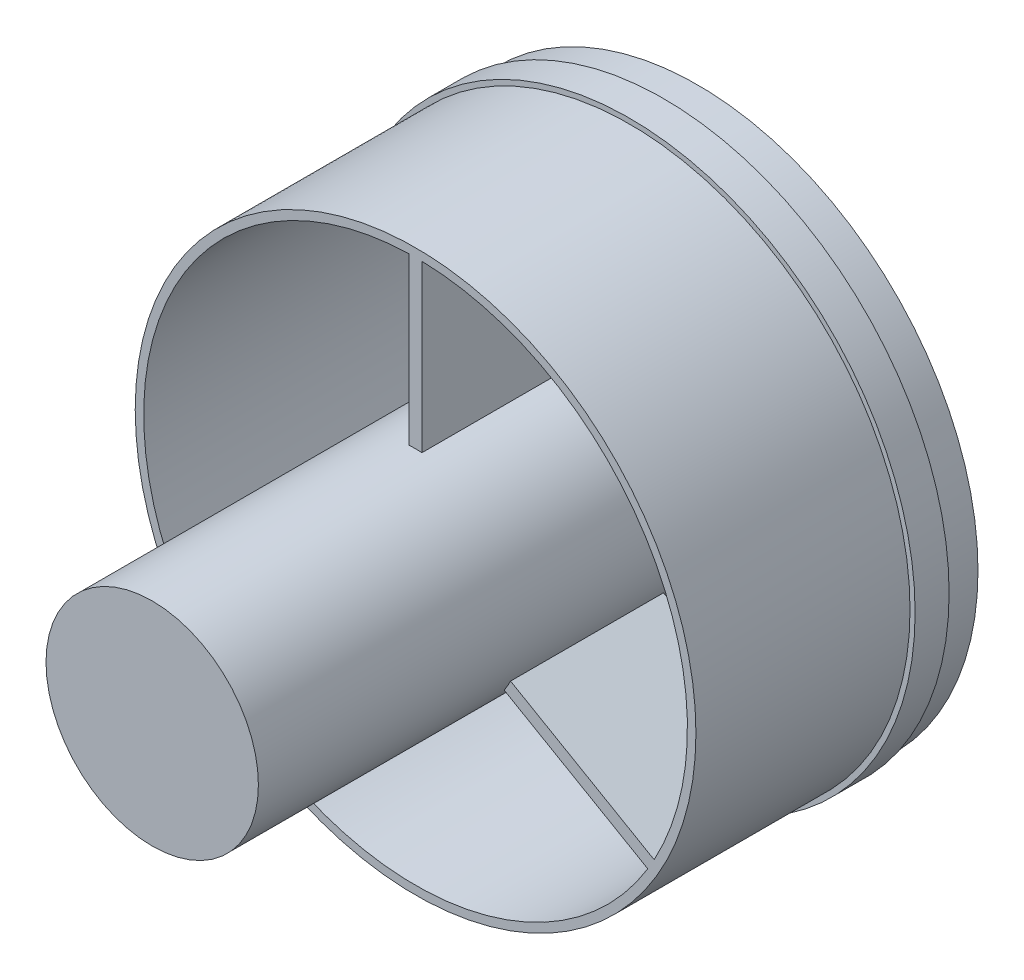
ISO-10303-21;
HEADER;
FILE_DESCRIPTION(('STEP AP214'),'2;1');
FILE_NAME('part.step','',(''),(''),'','','');
FILE_SCHEMA(('AUTOMOTIVE_DESIGN { 1 0 10303 214 1 1 1 1 }'));
ENDSEC;
DATA;
#1=APPLICATION_CONTEXT('core data for automotive mechanical design processes');
#2=APPLICATION_PROTOCOL_DEFINITION('international standard','automotive_design',2000,#1);
#3=PRODUCT_CONTEXT('',#1,'mechanical');
#4=PRODUCT('Part','Part','',(#3));
#5=PRODUCT_RELATED_PRODUCT_CATEGORY('part','',(#4));
#6=PRODUCT_DEFINITION_FORMATION('','',#4);
#7=PRODUCT_DEFINITION_CONTEXT('part definition',#1,'design');
#8=PRODUCT_DEFINITION('design','',#6,#7);
#9=PRODUCT_DEFINITION_SHAPE('','',#8);
#10=(LENGTH_UNIT() NAMED_UNIT(*) SI_UNIT(.MILLI.,.METRE.));
#11=(NAMED_UNIT(*) PLANE_ANGLE_UNIT() SI_UNIT($,.RADIAN.));
#12=(NAMED_UNIT(*) SI_UNIT($,.STERADIAN.) SOLID_ANGLE_UNIT());
#13=UNCERTAINTY_MEASURE_WITH_UNIT(LENGTH_MEASURE(1.E-05),#10,'distance_accuracy_value','');
#14=(GEOMETRIC_REPRESENTATION_CONTEXT(3) GLOBAL_UNCERTAINTY_ASSIGNED_CONTEXT((#13)) GLOBAL_UNIT_ASSIGNED_CONTEXT((#10,
#11,#12)) REPRESENTATION_CONTEXT('',''));
#15=CARTESIAN_POINT('',(0.,0.,0.));
#16=DIRECTION('',(0.,0.,1.));
#17=DIRECTION('',(1.,0.,0.));
#18=AXIS2_PLACEMENT_3D('',#15,#16,#17);
#19=CARTESIAN_POINT('',(0.,0.,0.));
#20=DIRECTION('',(0.,0.,1.));
#21=DIRECTION('',(1.,0.,0.));
#22=AXIS2_PLACEMENT_3D('',#19,#20,#21);
#23=PLANE('',#22);
#24=CARTESIAN_POINT('',(0.,0.,0.));
#25=DIRECTION('',(0.,0.,1.));
#26=DIRECTION('',(1.,0.,0.));
#27=AXIS2_PLACEMENT_3D('',#24,#25,#26);
#28=CIRCLE('',#27,33.);
#29=CARTESIAN_POINT('',(33.,0.,0.));
#30=VERTEX_POINT('',#29);
#31=EDGE_CURVE('E238',#30,#30,#28,.T.);
#32=ORIENTED_EDGE('',*,*,#31,.F.);
#33=EDGE_LOOP('',(#32));
#34=FACE_BOUND('',#33,.T.);
#35=CARTESIAN_POINT('',(0.,0.,0.));
#36=DIRECTION('',(0.,0.,1.));
#37=DIRECTION('',(1.,0.,0.));
#38=AXIS2_PLACEMENT_3D('',#35,#36,#37);
#39=CIRCLE('',#38,32.);
#40=CARTESIAN_POINT('',(32.,0.,0.));
#41=VERTEX_POINT('',#40);
#42=EDGE_CURVE('E233',#41,#41,#39,.T.);
#43=ORIENTED_EDGE('',*,*,#42,.T.);
#44=EDGE_LOOP('',(#43));
#45=FACE_BOUND('',#44,.T.);
#46=ADVANCED_FACE('F39',(#34,#45),#23,.F.);
#47=CARTESIAN_POINT('',(0.,0.,4.));
#48=DIRECTION('',(0.,0.,-1.));
#49=DIRECTION('',(-1.,0.,0.));
#50=AXIS2_PLACEMENT_3D('',#47,#48,#49);
#51=CYLINDRICAL_SURFACE('',#50,33.);
#52=CARTESIAN_POINT('',(0.,0.,4.));
#53=DIRECTION('',(0.,0.,1.));
#54=DIRECTION('',(1.,0.,0.));
#55=AXIS2_PLACEMENT_3D('',#52,#53,#54);
#56=CIRCLE('',#55,33.);
#57=CARTESIAN_POINT('',(33.,0.,4.));
#58=VERTEX_POINT('',#57);
#59=EDGE_CURVE('E229',#58,#58,#56,.T.);
#60=ORIENTED_EDGE('',*,*,#59,.F.);
#61=EDGE_LOOP('',(#60));
#62=FACE_BOUND('',#61,.T.);
#63=ORIENTED_EDGE('',*,*,#31,.T.);
#64=EDGE_LOOP('',(#63));
#65=FACE_BOUND('',#64,.T.);
#66=ADVANCED_FACE('F41',(#62,#65),#51,.T.);
#67=CARTESIAN_POINT('',(0.,0.,4.));
#68=DIRECTION('',(0.,0.,-1.));
#69=DIRECTION('',(-1.,0.,0.));
#70=AXIS2_PLACEMENT_3D('',#67,#68,#69);
#71=CYLINDRICAL_SURFACE('',#70,32.);
#72=DIRECTION('',(0.,0.,-1.));
#73=VECTOR('',#72,1.);
#74=CARTESIAN_POINT('',(-28.0802003241269,-15.3460858122488,4.));
#75=LINE('',#74,#73);
#76=CARTESIAN_POINT('',(-28.0802003241269,-15.3460858122488,15.2));
#77=VERTEX_POINT('',#76);
#78=CARTESIAN_POINT('',(-28.0802003241269,-15.3460858122488,33.2));
#79=VERTEX_POINT('',#78);
#80=EDGE_CURVE('E54',#77,#79,#75,.F.);
#81=ORIENTED_EDGE('',*,*,#80,.F.);
#82=CARTESIAN_POINT('',(0.,0.,15.2));
#83=DIRECTION('',(0.,0.,-1.));
#84=DIRECTION('',(-1.,0.,0.));
#85=AXIS2_PLACEMENT_3D('',#82,#83,#84);
#86=CIRCLE('',#85,32.);
#87=CARTESIAN_POINT('',(-27.3302003241269,-16.6451239179255,15.2));
#88=VERTEX_POINT('',#87);
#89=EDGE_CURVE('E58',#88,#77,#86,.T.);
#90=ORIENTED_EDGE('',*,*,#89,.F.);
#91=DIRECTION('',(0.,0.,-1.));
#92=VECTOR('',#91,1.);
#93=CARTESIAN_POINT('',(-27.3302003241269,-16.6451239179255,4.));
#94=LINE('',#93,#92);
#95=CARTESIAN_POINT('',(-27.3302003241269,-16.6451239179255,33.2));
#96=VERTEX_POINT('',#95);
#97=EDGE_CURVE('E140',#96,#88,#94,.T.);
#98=ORIENTED_EDGE('',*,*,#97,.F.);
#99=CARTESIAN_POINT('',(0.,0.,33.2));
#100=DIRECTION('',(0.,0.,1.));
#101=DIRECTION('',(1.,0.,0.));
#102=AXIS2_PLACEMENT_3D('',#99,#100,#101);
#103=CIRCLE('',#102,32.);
#104=CARTESIAN_POINT('',(27.3302003241269,-16.6451239179255,33.2));
#105=VERTEX_POINT('',#104);
#106=EDGE_CURVE('E221',#96,#105,#103,.T.);
#107=ORIENTED_EDGE('',*,*,#106,.T.);
#108=DIRECTION('',(0.,0.,-1.));
#109=VECTOR('',#108,1.);
#110=CARTESIAN_POINT('',(27.3302003241269,-16.6451239179255,4.));
#111=LINE('',#110,#109);
#112=CARTESIAN_POINT('',(27.3302003241269,-16.6451239179255,15.2));
#113=VERTEX_POINT('',#112);
#114=EDGE_CURVE('E178',#113,#105,#111,.F.);
#115=ORIENTED_EDGE('',*,*,#114,.F.);
#116=CARTESIAN_POINT('',(0.,0.,15.2));
#117=DIRECTION('',(0.,0.,-1.));
#118=DIRECTION('',(-1.,0.,0.));
#119=AXIS2_PLACEMENT_3D('',#116,#117,#118);
#120=CIRCLE('',#119,32.);
#121=CARTESIAN_POINT('',(28.0802003241269,-15.3460858122488,15.2));
#122=VERTEX_POINT('',#121);
#123=EDGE_CURVE('E171',#122,#113,#120,.T.);
#124=ORIENTED_EDGE('',*,*,#123,.F.);
#125=DIRECTION('',(0.,0.,-1.));
#126=VECTOR('',#125,1.);
#127=CARTESIAN_POINT('',(28.0802003241269,-15.3460858122488,4.));
#128=LINE('',#127,#126);
#129=CARTESIAN_POINT('',(28.0802003241269,-15.3460858122488,33.2));
#130=VERTEX_POINT('',#129);
#131=EDGE_CURVE('E175',#130,#122,#128,.T.);
#132=ORIENTED_EDGE('',*,*,#131,.F.);
#133=CARTESIAN_POINT('',(0.75,31.9912097301743,33.2));
#134=VERTEX_POINT('',#133);
#135=EDGE_CURVE('E217',#130,#134,#103,.T.);
#136=ORIENTED_EDGE('',*,*,#135,.T.);
#137=DIRECTION('',(0.,0.,-1.));
#138=VECTOR('',#137,1.);
#139=CARTESIAN_POINT('',(0.75,31.9912097301743,4.));
#140=LINE('',#139,#138);
#141=CARTESIAN_POINT('',(0.75,31.9912097301743,15.2));
#142=VERTEX_POINT('',#141);
#143=EDGE_CURVE('E214',#142,#134,#140,.F.);
#144=ORIENTED_EDGE('',*,*,#143,.F.);
#145=CARTESIAN_POINT('',(0.,0.,15.2));
#146=DIRECTION('',(0.,0.,-1.));
#147=DIRECTION('',(-1.,0.,0.));
#148=AXIS2_PLACEMENT_3D('',#145,#146,#147);
#149=CIRCLE('',#148,32.);
#150=CARTESIAN_POINT('',(-0.75,31.9912097301743,15.2));
#151=VERTEX_POINT('',#150);
#152=EDGE_CURVE('E206',#151,#142,#149,.T.);
#153=ORIENTED_EDGE('',*,*,#152,.F.);
#154=DIRECTION('',(0.,0.,-1.));
#155=VECTOR('',#154,1.);
#156=CARTESIAN_POINT('',(-0.75,31.9912097301743,4.));
#157=LINE('',#156,#155);
#158=CARTESIAN_POINT('',(-0.75,31.9912097301743,33.2));
#159=VERTEX_POINT('',#158);
#160=EDGE_CURVE('E211',#159,#151,#157,.T.);
#161=ORIENTED_EDGE('',*,*,#160,.F.);
#162=EDGE_CURVE('E218',#159,#79,#103,.T.);
#163=ORIENTED_EDGE('',*,*,#162,.T.);
#164=EDGE_LOOP('',(#81,#90,#98,#107,#115,#124,#132,#136,#144,#153,#161,#163));
#165=FACE_BOUND('',#164,.T.);
#166=ORIENTED_EDGE('',*,*,#42,.F.);
#167=EDGE_LOOP('',(#166));
#168=FACE_BOUND('',#167,.T.);
#169=ADVANCED_FACE('F262',(#165,#168),#71,.F.);
#170=CARTESIAN_POINT('',(0.,0.,8.));
#171=DIRECTION('',(0.,0.,1.));
#172=DIRECTION('',(1.,0.,0.));
#173=AXIS2_PLACEMENT_3D('',#170,#171,#172);
#174=PLANE('',#173);
#175=CARTESIAN_POINT('',(0.,0.,8.));
#176=DIRECTION('',(0.,0.,1.));
#177=DIRECTION('',(1.,0.,0.));
#178=AXIS2_PLACEMENT_3D('',#175,#176,#177);
#179=CIRCLE('',#178,33.);
#180=CARTESIAN_POINT('',(33.,0.,8.));
#181=VERTEX_POINT('',#180);
#182=EDGE_CURVE('E225',#181,#181,#179,.T.);
#183=ORIENTED_EDGE('',*,*,#182,.F.);
#184=EDGE_LOOP('',(#183));
#185=FACE_BOUND('',#184,.T.);
#186=CARTESIAN_POINT('',(0.,0.,8.));
#187=DIRECTION('',(0.,0.,1.));
#188=DIRECTION('',(1.,0.,0.));
#189=AXIS2_PLACEMENT_3D('',#186,#187,#188);
#190=CIRCLE('',#189,33.6);
#191=CARTESIAN_POINT('',(33.6,0.,8.));
#192=VERTEX_POINT('',#191);
#193=EDGE_CURVE('E230',#192,#192,#190,.T.);
#194=ORIENTED_EDGE('',*,*,#193,.T.);
#195=EDGE_LOOP('',(#194));
#196=FACE_BOUND('',#195,.T.);
#197=ADVANCED_FACE('F301',(#185,#196),#174,.T.);
#198=CARTESIAN_POINT('',(0.,0.,4.));
#199=DIRECTION('',(0.,0.,1.));
#200=DIRECTION('',(1.,0.,0.));
#201=AXIS2_PLACEMENT_3D('',#198,#199,#200);
#202=PLANE('',#201);
#203=ORIENTED_EDGE('',*,*,#59,.T.);
#204=EDGE_LOOP('',(#203));
#205=FACE_BOUND('',#204,.T.);
#206=CARTESIAN_POINT('',(0.,0.,4.));
#207=DIRECTION('',(0.,0.,1.));
#208=DIRECTION('',(1.,0.,0.));
#209=AXIS2_PLACEMENT_3D('',#206,#207,#208);
#210=CIRCLE('',#209,33.6);
#211=CARTESIAN_POINT('',(33.6,0.,4.));
#212=VERTEX_POINT('',#211);
#213=EDGE_CURVE('E224',#212,#212,#210,.T.);
#214=ORIENTED_EDGE('',*,*,#213,.F.);
#215=EDGE_LOOP('',(#214));
#216=FACE_BOUND('',#215,.T.);
#217=ADVANCED_FACE('F305',(#205,#216),#202,.F.);
#218=CARTESIAN_POINT('',(0.,0.,8.));
#219=DIRECTION('',(0.,0.,-1.));
#220=DIRECTION('',(-1.,0.,0.));
#221=AXIS2_PLACEMENT_3D('',#218,#219,#220);
#222=CYLINDRICAL_SURFACE('',#221,33.6);
#223=ORIENTED_EDGE('',*,*,#193,.F.);
#224=EDGE_LOOP('',(#223));
#225=FACE_BOUND('',#224,.T.);
#226=ORIENTED_EDGE('',*,*,#213,.T.);
#227=EDGE_LOOP('',(#226));
#228=FACE_BOUND('',#227,.T.);
#229=ADVANCED_FACE('F302',(#225,#228),#222,.T.);
#230=CARTESIAN_POINT('',(0.,0.,33.2));
#231=DIRECTION('',(0.,0.,1.));
#232=DIRECTION('',(1.,0.,0.));
#233=AXIS2_PLACEMENT_3D('',#230,#231,#232);
#234=PLANE('',#233);
#235=CARTESIAN_POINT('',(0.,0.,33.2));
#236=DIRECTION('',(0.,0.,1.));
#237=DIRECTION('',(1.,0.,0.));
#238=AXIS2_PLACEMENT_3D('',#235,#236,#237);
#239=CIRCLE('',#238,33.);
#240=CARTESIAN_POINT('',(33.,0.,33.2));
#241=VERTEX_POINT('',#240);
#242=EDGE_CURVE('E220',#241,#241,#239,.T.);
#243=ORIENTED_EDGE('',*,*,#242,.T.);
#244=EDGE_LOOP('',(#243));
#245=FACE_BOUND('',#244,.T.);
#246=ORIENTED_EDGE('',*,*,#106,.F.);
#247=DIRECTION('',(0.866025403784438,0.5,0.));
#248=VECTOR('',#247,1.);
#249=CARTESIAN_POINT('',(-10.4308144070681,-6.88825890957223,33.2));
#250=LINE('',#249,#248);
#251=CARTESIAN_POINT('',(-10.4308144070681,-6.88825890957221,33.2));
#252=VERTEX_POINT('',#251);
#253=EDGE_CURVE('E430',#96,#252,#250,.T.);
#254=ORIENTED_EDGE('',*,*,#253,.T.);
#255=CARTESIAN_POINT('',(0.,0.,33.2));
#256=DIRECTION('',(0.,0.,-1.));
#257=DIRECTION('',(-1.,0.,0.));
#258=AXIS2_PLACEMENT_3D('',#255,#256,#257);
#259=CIRCLE('',#258,12.5);
#260=CARTESIAN_POINT('',(-11.1808144070681,-5.58922080389556,33.2));
#261=VERTEX_POINT('',#260);
#262=EDGE_CURVE('E47',#261,#252,#259,.F.);
#263=ORIENTED_EDGE('',*,*,#262,.F.);
#264=DIRECTION('',(-0.866025403784438,-0.500000000000001,0.));
#265=VECTOR('',#264,1.);
#266=CARTESIAN_POINT('',(-28.9464564732007,-15.8462190331038,33.2));
#267=LINE('',#266,#265);
#268=EDGE_CURVE('E141',#261,#79,#267,.T.);
#269=ORIENTED_EDGE('',*,*,#268,.T.);
#270=ORIENTED_EDGE('',*,*,#162,.F.);
#271=DIRECTION('',(0.,-1.,0.));
#272=VECTOR('',#271,1.);
#273=CARTESIAN_POINT('',(-0.750000000000003,12.4774797134678,33.2));
#274=LINE('',#273,#272);
#275=CARTESIAN_POINT('',(-0.750000000000003,12.4774797134678,33.2));
#276=VERTEX_POINT('',#275);
#277=EDGE_CURVE('E191',#159,#276,#274,.T.);
#278=ORIENTED_EDGE('',*,*,#277,.T.);
#279=CARTESIAN_POINT('',(0.,0.,33.2));
#280=DIRECTION('',(0.,0.,1.));
#281=DIRECTION('',(1.,0.,0.));
#282=AXIS2_PLACEMENT_3D('',#279,#280,#281);
#283=CIRCLE('',#282,12.5);
#284=CARTESIAN_POINT('',(0.750000000000003,12.4774797134678,33.2));
#285=VERTEX_POINT('',#284);
#286=EDGE_CURVE('E189',#285,#276,#283,.T.);
#287=ORIENTED_EDGE('',*,*,#286,.F.);
#288=DIRECTION('',(0.,1.,0.));
#289=VECTOR('',#288,1.);
#290=CARTESIAN_POINT('',(0.75,32.9914761718842,33.2));
#291=LINE('',#290,#289);
#292=EDGE_CURVE('E196',#285,#134,#291,.T.);
#293=ORIENTED_EDGE('',*,*,#292,.T.);
#294=ORIENTED_EDGE('',*,*,#135,.F.);
#295=DIRECTION('',(-0.866025403784439,0.5,0.));
#296=VECTOR('',#295,1.);
#297=CARTESIAN_POINT('',(11.1808144070681,-5.58922080389556,33.2));
#298=LINE('',#297,#296);
#299=CARTESIAN_POINT('',(11.1808144070681,-5.58922080389557,33.2));
#300=VERTEX_POINT('',#299);
#301=EDGE_CURVE('E155',#130,#300,#298,.T.);
#302=ORIENTED_EDGE('',*,*,#301,.T.);
#303=CARTESIAN_POINT('',(0.,0.,33.2));
#304=DIRECTION('',(0.,0.,-1.));
#305=DIRECTION('',(-1.,0.,0.));
#306=AXIS2_PLACEMENT_3D('',#303,#304,#305);
#307=CIRCLE('',#306,12.5);
#308=CARTESIAN_POINT('',(10.4308144070681,-6.88825890957222,33.2));
#309=VERTEX_POINT('',#308);
#310=EDGE_CURVE('E228',#309,#300,#307,.F.);
#311=ORIENTED_EDGE('',*,*,#310,.F.);
#312=DIRECTION('',(0.866025403784439,-0.5,0.));
#313=VECTOR('',#312,1.);
#314=CARTESIAN_POINT('',(28.1964564732007,-17.1452571387804,33.2));
#315=LINE('',#314,#313);
#316=EDGE_CURVE('E160',#309,#105,#315,.T.);
#317=ORIENTED_EDGE('',*,*,#316,.T.);
#318=EDGE_LOOP('',(#246,#254,#263,#269,#270,#278,#287,#293,#294,#302,#311,#317));
#319=FACE_BOUND('',#318,.T.);
#320=ADVANCED_FACE('F259',(#245,#319),#234,.T.);
#321=CARTESIAN_POINT('',(0.,0.,33.2));
#322=DIRECTION('',(0.,0.,-1.));
#323=DIRECTION('',(-1.,0.,0.));
#324=AXIS2_PLACEMENT_3D('',#321,#322,#323);
#325=CYLINDRICAL_SURFACE('',#324,33.);
#326=ORIENTED_EDGE('',*,*,#242,.F.);
#327=EDGE_LOOP('',(#326));
#328=FACE_BOUND('',#327,.T.);
#329=ORIENTED_EDGE('',*,*,#182,.T.);
#330=EDGE_LOOP('',(#329));
#331=FACE_BOUND('',#330,.T.);
#332=ADVANCED_FACE('F313',(#328,#331),#325,.T.);
#333=CARTESIAN_POINT('',(0.,0.,15.2));
#334=DIRECTION('',(0.,0.,-1.));
#335=DIRECTION('',(-1.,0.,0.));
#336=AXIS2_PLACEMENT_3D('',#333,#334,#335);
#337=PLANE('',#336);
#338=CARTESIAN_POINT('',(0.,0.,15.2));
#339=DIRECTION('',(0.,0.,-1.));
#340=DIRECTION('',(-1.,0.,0.));
#341=AXIS2_PLACEMENT_3D('',#338,#339,#340);
#342=CIRCLE('',#341,12.5);
#343=CARTESIAN_POINT('',(-0.750000000000003,12.4774797134678,15.2));
#344=VERTEX_POINT('',#343);
#345=CARTESIAN_POINT('',(0.750000000000003,12.4774797134678,15.2));
#346=VERTEX_POINT('',#345);
#347=EDGE_CURVE('E187',#344,#346,#342,.T.);
#348=ORIENTED_EDGE('',*,*,#347,.F.);
#349=DIRECTION('',(0.,-1.,0.));
#350=VECTOR('',#349,1.);
#351=CARTESIAN_POINT('',(-0.750000000000003,12.4774797134678,15.2));
#352=LINE('',#351,#350);
#353=EDGE_CURVE('E192',#151,#344,#352,.T.);
#354=ORIENTED_EDGE('',*,*,#353,.F.);
#355=ORIENTED_EDGE('',*,*,#152,.T.);
#356=DIRECTION('',(0.,1.,0.));
#357=VECTOR('',#356,1.);
#358=CARTESIAN_POINT('',(0.75,32.9914761718842,15.2));
#359=LINE('',#358,#357);
#360=EDGE_CURVE('E195',#346,#142,#359,.T.);
#361=ORIENTED_EDGE('',*,*,#360,.F.);
#362=EDGE_LOOP('',(#348,#354,#355,#361));
#363=FACE_BOUND('',#362,.T.);
#364=ADVANCED_FACE('F274',(#363),#337,.T.);
#365=CARTESIAN_POINT('',(0.75,32.9914761718842,15.2));
#366=DIRECTION('',(1.,0.,0.));
#367=DIRECTION('',(0.,1.,0.));
#368=AXIS2_PLACEMENT_3D('',#365,#366,#367);
#369=PLANE('',#368);
#370=ORIENTED_EDGE('',*,*,#360,.T.);
#371=ORIENTED_EDGE('',*,*,#143,.T.);
#372=ORIENTED_EDGE('',*,*,#292,.F.);
#373=DIRECTION('',(0.,0.,1.));
#374=VECTOR('',#373,1.);
#375=CARTESIAN_POINT('',(0.750000000000003,12.4774797134678,15.2));
#376=LINE('',#375,#374);
#377=EDGE_CURVE('E204',#346,#285,#376,.T.);
#378=ORIENTED_EDGE('',*,*,#377,.F.);
#379=EDGE_LOOP('',(#370,#371,#372,#378));
#380=FACE_BOUND('',#379,.T.);
#381=ADVANCED_FACE('F266',(#380),#369,.T.);
#382=CARTESIAN_POINT('',(-0.750000000000003,12.4774797134678,15.2));
#383=DIRECTION('',(-1.,0.,0.));
#384=DIRECTION('',(0.,-1.,0.));
#385=AXIS2_PLACEMENT_3D('',#382,#383,#384);
#386=PLANE('',#385);
#387=ORIENTED_EDGE('',*,*,#277,.F.);
#388=ORIENTED_EDGE('',*,*,#160,.T.);
#389=ORIENTED_EDGE('',*,*,#353,.T.);
#390=DIRECTION('',(0.,0.,1.));
#391=VECTOR('',#390,1.);
#392=CARTESIAN_POINT('',(-0.750000000000003,12.4774797134678,15.2));
#393=LINE('',#392,#391);
#394=EDGE_CURVE('E199',#344,#276,#393,.T.);
#395=ORIENTED_EDGE('',*,*,#394,.T.);
#396=EDGE_LOOP('',(#387,#388,#389,#395));
#397=FACE_BOUND('',#396,.T.);
#398=ADVANCED_FACE('F278',(#397),#386,.T.);
#399=CARTESIAN_POINT('',(0.,0.,64.2));
#400=DIRECTION('',(0.,0.,1.));
#401=DIRECTION('',(1.,0.,0.));
#402=AXIS2_PLACEMENT_3D('',#399,#400,#401);
#403=PLANE('',#402);
#404=CARTESIAN_POINT('',(0.,0.,64.2));
#405=DIRECTION('',(0.,0.,1.));
#406=DIRECTION('',(1.,0.,0.));
#407=AXIS2_PLACEMENT_3D('',#404,#405,#406);
#408=CIRCLE('',#407,12.5);
#409=CARTESIAN_POINT('',(12.5,0.,64.2));
#410=VERTEX_POINT('',#409);
#411=EDGE_CURVE('E181',#410,#410,#408,.F.);
#412=ORIENTED_EDGE('',*,*,#411,.F.);
#413=EDGE_LOOP('',(#412));
#414=FACE_BOUND('',#413,.T.);
#415=ADVANCED_FACE('F280',(#414),#403,.T.);
#416=CARTESIAN_POINT('',(0.,0.,99.5553390593274));
#417=DIRECTION('',(0.,0.,-1.));
#418=DIRECTION('',(-1.,0.,0.));
#419=AXIS2_PLACEMENT_3D('',#416,#417,#418);
#420=CYLINDRICAL_SURFACE('',#419,12.5);
#421=CARTESIAN_POINT('',(0.,0.,15.2));
#422=DIRECTION('',(0.,0.,-1.));
#423=DIRECTION('',(-1.,0.,0.));
#424=AXIS2_PLACEMENT_3D('',#421,#422,#423);
#425=CIRCLE('',#424,12.5);
#426=CARTESIAN_POINT('',(-11.1808144070681,-5.58922080389556,15.2));
#427=VERTEX_POINT('',#426);
#428=CARTESIAN_POINT('',(-10.4308144070681,-6.88825890957223,15.2));
#429=VERTEX_POINT('',#428);
#430=EDGE_CURVE('E12',#427,#429,#425,.F.);
#431=ORIENTED_EDGE('',*,*,#430,.F.);
#432=DIRECTION('',(0.,0.,1.));
#433=VECTOR('',#432,1.);
#434=CARTESIAN_POINT('',(-11.1808144070681,-5.58922080389556,15.2));
#435=LINE('',#434,#433);
#436=EDGE_CURVE('E146',#427,#261,#435,.T.);
#437=ORIENTED_EDGE('',*,*,#436,.T.);
#438=ORIENTED_EDGE('',*,*,#262,.T.);
#439=DIRECTION('',(0.,0.,1.));
#440=VECTOR('',#439,1.);
#441=CARTESIAN_POINT('',(-10.4308144070681,-6.88825890957223,15.2));
#442=LINE('',#441,#440);
#443=EDGE_CURVE('E138',#429,#252,#442,.T.);
#444=ORIENTED_EDGE('',*,*,#443,.F.);
#445=EDGE_LOOP('',(#431,#437,#438,#444));
#446=FACE_BOUND('',#445,.T.);
#447=CARTESIAN_POINT('',(0.,0.,15.2));
#448=DIRECTION('',(0.,0.,-1.));
#449=DIRECTION('',(-1.,0.,0.));
#450=AXIS2_PLACEMENT_3D('',#447,#448,#449);
#451=CIRCLE('',#450,12.5);
#452=CARTESIAN_POINT('',(10.4308144070681,-6.88825890957222,15.2));
#453=VERTEX_POINT('',#452);
#454=CARTESIAN_POINT('',(11.1808144070681,-5.58922080389556,15.2));
#455=VERTEX_POINT('',#454);
#456=EDGE_CURVE('E245',#453,#455,#451,.F.);
#457=ORIENTED_EDGE('',*,*,#456,.F.);
#458=DIRECTION('',(0.,0.,1.));
#459=VECTOR('',#458,1.);
#460=CARTESIAN_POINT('',(10.4308144070681,-6.88825890957222,15.2));
#461=LINE('',#460,#459);
#462=EDGE_CURVE('E168',#453,#309,#461,.T.);
#463=ORIENTED_EDGE('',*,*,#462,.T.);
#464=ORIENTED_EDGE('',*,*,#310,.T.);
#465=DIRECTION('',(0.,0.,1.));
#466=VECTOR('',#465,1.);
#467=CARTESIAN_POINT('',(11.1808144070681,-5.58922080389556,15.2));
#468=LINE('',#467,#466);
#469=EDGE_CURVE('E163',#455,#300,#468,.T.);
#470=ORIENTED_EDGE('',*,*,#469,.F.);
#471=EDGE_LOOP('',(#457,#463,#464,#470));
#472=FACE_BOUND('',#471,.T.);
#473=ORIENTED_EDGE('',*,*,#347,.T.);
#474=ORIENTED_EDGE('',*,*,#377,.T.);
#475=ORIENTED_EDGE('',*,*,#286,.T.);
#476=ORIENTED_EDGE('',*,*,#394,.F.);
#477=EDGE_LOOP('',(#473,#474,#475,#476));
#478=FACE_BOUND('',#477,.T.);
#479=CARTESIAN_POINT('',(0.,0.,0.));
#480=DIRECTION('',(0.,0.,-1.));
#481=DIRECTION('',(-1.,0.,0.));
#482=AXIS2_PLACEMENT_3D('',#479,#480,#481);
#483=CIRCLE('',#482,12.5);
#484=CARTESIAN_POINT('',(-12.5,0.,0.));
#485=VERTEX_POINT('',#484);
#486=EDGE_CURVE('E184',#485,#485,#483,.F.);
#487=ORIENTED_EDGE('',*,*,#486,.T.);
#488=EDGE_LOOP('',(#487));
#489=FACE_BOUND('',#488,.T.);
#490=ORIENTED_EDGE('',*,*,#411,.T.);
#491=EDGE_LOOP('',(#490));
#492=FACE_BOUND('',#491,.T.);
#493=ADVANCED_FACE('F144',(#446,#472,#478,#489,#492),#420,.T.);
#494=CARTESIAN_POINT('',(0.,0.,0.));
#495=DIRECTION('',(0.,0.,-1.));
#496=DIRECTION('',(-1.,0.,0.));
#497=AXIS2_PLACEMENT_3D('',#494,#495,#496);
#498=SPHERICAL_SURFACE('',#497,12.5);
#499=ORIENTED_EDGE('',*,*,#486,.F.);
#500=EDGE_LOOP('',(#499));
#501=FACE_BOUND('',#500,.T.);
#502=ADVANCED_FACE('F365',(#501),#498,.T.);
#503=CARTESIAN_POINT('',(28.1964564732007,-17.1452571387804,15.2));
#504=DIRECTION('',(-0.5,-0.866025403784439,0.));
#505=DIRECTION('',(0.866025403784439,-0.5,0.));
#506=AXIS2_PLACEMENT_3D('',#503,#504,#505);
#507=PLANE('',#506);
#508=DIRECTION('',(0.866025403784439,-0.5,0.));
#509=VECTOR('',#508,1.);
#510=CARTESIAN_POINT('',(28.1964564732007,-17.1452571387804,15.2));
#511=LINE('',#510,#509);
#512=EDGE_CURVE('E159',#453,#113,#511,.T.);
#513=ORIENTED_EDGE('',*,*,#512,.T.);
#514=ORIENTED_EDGE('',*,*,#114,.T.);
#515=ORIENTED_EDGE('',*,*,#316,.F.);
#516=ORIENTED_EDGE('',*,*,#462,.F.);
#517=EDGE_LOOP('',(#513,#514,#515,#516));
#518=FACE_BOUND('',#517,.T.);
#519=ADVANCED_FACE('F261',(#518),#507,.T.);
#520=CARTESIAN_POINT('',(11.1808144070681,-5.58922080389556,15.2));
#521=DIRECTION('',(0.5,0.866025403784439,0.));
#522=DIRECTION('',(-0.866025403784439,0.5,0.));
#523=AXIS2_PLACEMENT_3D('',#520,#521,#522);
#524=PLANE('',#523);
#525=ORIENTED_EDGE('',*,*,#301,.F.);
#526=ORIENTED_EDGE('',*,*,#131,.T.);
#527=DIRECTION('',(-0.866025403784439,0.5,0.));
#528=VECTOR('',#527,1.);
#529=CARTESIAN_POINT('',(11.1808144070681,-5.58922080389556,15.2));
#530=LINE('',#529,#528);
#531=EDGE_CURVE('E156',#122,#455,#530,.T.);
#532=ORIENTED_EDGE('',*,*,#531,.T.);
#533=ORIENTED_EDGE('',*,*,#469,.T.);
#534=EDGE_LOOP('',(#525,#526,#532,#533));
#535=FACE_BOUND('',#534,.T.);
#536=ADVANCED_FACE('F254',(#535),#524,.T.);
#537=CARTESIAN_POINT('',(0.,0.,15.2));
#538=DIRECTION('',(0.,0.,-1.));
#539=DIRECTION('',(-1.,0.,0.));
#540=AXIS2_PLACEMENT_3D('',#537,#538,#539);
#541=PLANE('',#540);
#542=ORIENTED_EDGE('',*,*,#531,.F.);
#543=ORIENTED_EDGE('',*,*,#123,.T.);
#544=ORIENTED_EDGE('',*,*,#512,.F.);
#545=ORIENTED_EDGE('',*,*,#456,.T.);
#546=EDGE_LOOP('',(#542,#543,#544,#545));
#547=FACE_BOUND('',#546,.T.);
#548=ADVANCED_FACE('F250',(#547),#541,.T.);
#549=CARTESIAN_POINT('',(-28.9464564732007,-15.8462190331038,15.2));
#550=DIRECTION('',(-0.500000000000001,0.866025403784438,0.));
#551=DIRECTION('',(-0.866025403784438,-0.500000000000001,0.));
#552=AXIS2_PLACEMENT_3D('',#549,#550,#551);
#553=PLANE('',#552);
#554=DIRECTION('',(-0.866025403784438,-0.500000000000001,0.));
#555=VECTOR('',#554,1.);
#556=CARTESIAN_POINT('',(-28.9464564732007,-15.8462190331038,15.2));
#557=LINE('',#556,#555);
#558=EDGE_CURVE('E131',#427,#77,#557,.T.);
#559=ORIENTED_EDGE('',*,*,#558,.T.);
#560=ORIENTED_EDGE('',*,*,#80,.T.);
#561=ORIENTED_EDGE('',*,*,#268,.F.);
#562=ORIENTED_EDGE('',*,*,#436,.F.);
#563=EDGE_LOOP('',(#559,#560,#561,#562));
#564=FACE_BOUND('',#563,.T.);
#565=ADVANCED_FACE('F399',(#564),#553,.T.);
#566=CARTESIAN_POINT('',(-10.4308144070681,-6.88825890957223,15.2));
#567=DIRECTION('',(0.5,-0.866025403784438,0.));
#568=DIRECTION('',(0.866025403784438,0.5,0.));
#569=AXIS2_PLACEMENT_3D('',#566,#567,#568);
#570=PLANE('',#569);
#571=ORIENTED_EDGE('',*,*,#253,.F.);
#572=ORIENTED_EDGE('',*,*,#97,.T.);
#573=DIRECTION('',(0.866025403784438,0.5,0.));
#574=VECTOR('',#573,1.);
#575=CARTESIAN_POINT('',(-10.4308144070681,-6.88825890957223,15.2));
#576=LINE('',#575,#574);
#577=EDGE_CURVE('E129',#88,#429,#576,.T.);
#578=ORIENTED_EDGE('',*,*,#577,.T.);
#579=ORIENTED_EDGE('',*,*,#443,.T.);
#580=EDGE_LOOP('',(#571,#572,#578,#579));
#581=FACE_BOUND('',#580,.T.);
#582=ADVANCED_FACE('F137',(#581),#570,.T.);
#583=CARTESIAN_POINT('',(0.,0.,15.2));
#584=DIRECTION('',(0.,0.,-1.));
#585=DIRECTION('',(-1.,0.,0.));
#586=AXIS2_PLACEMENT_3D('',#583,#584,#585);
#587=PLANE('',#586);
#588=ORIENTED_EDGE('',*,*,#577,.F.);
#589=ORIENTED_EDGE('',*,*,#89,.T.);
#590=ORIENTED_EDGE('',*,*,#558,.F.);
#591=ORIENTED_EDGE('',*,*,#430,.T.);
#592=EDGE_LOOP('',(#588,#589,#590,#591));
#593=FACE_BOUND('',#592,.T.);
#594=ADVANCED_FACE('F128',(#593),#587,.T.);
#595=CLOSED_SHELL('',(#46,#66,#169,#197,#217,#229,#320,#332,#364,#381,#398,#415,#493,#502,#519,
#536,#548,#565,#582,#594));
#596=MANIFOLD_SOLID_BREP('B2',#595);
#597=ADVANCED_BREP_SHAPE_REPRESENTATION('',(#18,#596),#14);
#598=SHAPE_DEFINITION_REPRESENTATION(#9,#597);
ENDSEC;
END-ISO-10303-21;
